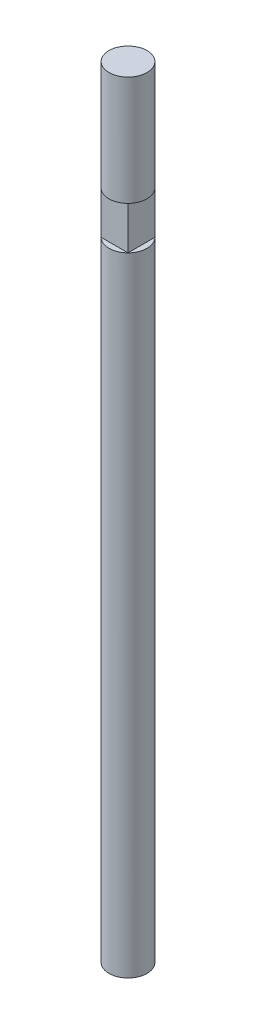
ISO-10303-21;
HEADER;
FILE_DESCRIPTION(('STEP AP214'),'2;1');
FILE_NAME('part.step','',(''),(''),'','','');
FILE_SCHEMA(('AUTOMOTIVE_DESIGN { 1 0 10303 214 1 1 1 1 }'));
ENDSEC;
DATA;
#1=APPLICATION_CONTEXT('core data for automotive mechanical design processes');
#2=APPLICATION_PROTOCOL_DEFINITION('international standard','automotive_design',2000,#1);
#3=PRODUCT_CONTEXT('',#1,'mechanical');
#4=PRODUCT('Part','Part','',(#3));
#5=PRODUCT_RELATED_PRODUCT_CATEGORY('part','',(#4));
#6=PRODUCT_DEFINITION_FORMATION('','',#4);
#7=PRODUCT_DEFINITION_CONTEXT('part definition',#1,'design');
#8=PRODUCT_DEFINITION('design','',#6,#7);
#9=PRODUCT_DEFINITION_SHAPE('','',#8);
#10=(LENGTH_UNIT() NAMED_UNIT(*) SI_UNIT(.MILLI.,.METRE.));
#11=(NAMED_UNIT(*) PLANE_ANGLE_UNIT() SI_UNIT($,.RADIAN.));
#12=(NAMED_UNIT(*) SI_UNIT($,.STERADIAN.) SOLID_ANGLE_UNIT());
#13=UNCERTAINTY_MEASURE_WITH_UNIT(LENGTH_MEASURE(1.E-05),#10,'distance_accuracy_value','');
#14=(GEOMETRIC_REPRESENTATION_CONTEXT(3) GLOBAL_UNCERTAINTY_ASSIGNED_CONTEXT((#13)) GLOBAL_UNIT_ASSIGNED_CONTEXT((#10,
#11,#12)) REPRESENTATION_CONTEXT('',''));
#15=CARTESIAN_POINT('',(0.,0.,0.));
#16=DIRECTION('',(0.,0.,1.));
#17=DIRECTION('',(1.,0.,0.));
#18=AXIS2_PLACEMENT_3D('',#15,#16,#17);
#19=CARTESIAN_POINT('',(0.,82.,0.));
#20=DIRECTION('',(0.,-1.,0.));
#21=DIRECTION('',(0.,0.,-1.));
#22=AXIS2_PLACEMENT_3D('',#19,#20,#21);
#23=CYLINDRICAL_SURFACE('',#22,2.);
#24=CARTESIAN_POINT('',(0.,82.,0.));
#25=DIRECTION('',(0.,1.,0.));
#26=DIRECTION('',(0.,0.,1.));
#27=AXIS2_PLACEMENT_3D('',#24,#25,#26);
#28=CIRCLE('',#27,2.);
#29=CARTESIAN_POINT('',(0.,82.,2.));
#30=VERTEX_POINT('',#29);
#31=EDGE_CURVE('E91',#30,#30,#28,.T.);
#32=ORIENTED_EDGE('',*,*,#31,.F.);
#33=EDGE_LOOP('',(#32));
#34=FACE_BOUND('',#33,.T.);
#35=CARTESIAN_POINT('',(0.,0.,0.));
#36=DIRECTION('',(0.,1.,0.));
#37=DIRECTION('',(0.,0.,1.));
#38=AXIS2_PLACEMENT_3D('',#35,#36,#37);
#39=CIRCLE('',#38,2.);
#40=CARTESIAN_POINT('',(0.,0.,2.));
#41=VERTEX_POINT('',#40);
#42=EDGE_CURVE('E94',#41,#41,#39,.T.);
#43=ORIENTED_EDGE('',*,*,#42,.T.);
#44=EDGE_LOOP('',(#43));
#45=FACE_BOUND('',#44,.T.);
#46=CARTESIAN_POINT('',(0.,66.,0.));
#47=DIRECTION('',(0.,1.,0.));
#48=DIRECTION('',(0.,0.,1.));
#49=AXIS2_PLACEMENT_3D('',#46,#47,#48);
#50=CIRCLE('',#49,2.);
#51=CARTESIAN_POINT('',(1.4142135623731,66.,1.41421356237309));
#52=VERTEX_POINT('',#51);
#53=CARTESIAN_POINT('',(1.41421356237309,66.,-1.41421356237309));
#54=VERTEX_POINT('',#53);
#55=EDGE_CURVE('E35',#52,#54,#50,.T.);
#56=ORIENTED_EDGE('',*,*,#55,.F.);
#57=CARTESIAN_POINT('',(-1.41421356237309,66.,1.41421356237309));
#58=VERTEX_POINT('',#57);
#59=EDGE_CURVE('E11',#58,#52,#50,.T.);
#60=ORIENTED_EDGE('',*,*,#59,.F.);
#61=DIRECTION('',(0.,1.,0.));
#62=VECTOR('',#61,1.);
#63=CARTESIAN_POINT('',(-1.41421356237309,66.,1.41421356237309));
#64=LINE('',#63,#62);
#65=CARTESIAN_POINT('',(-1.41421356237309,70.5,1.41421356237309));
#66=VERTEX_POINT('',#65);
#67=EDGE_CURVE('E48',#58,#66,#64,.T.);
#68=ORIENTED_EDGE('',*,*,#67,.T.);
#69=CARTESIAN_POINT('',(0.,70.5,0.));
#70=DIRECTION('',(0.,1.,0.));
#71=DIRECTION('',(0.,0.,1.));
#72=AXIS2_PLACEMENT_3D('',#69,#70,#71);
#73=CIRCLE('',#72,2.);
#74=CARTESIAN_POINT('',(1.4142135623731,70.5,1.41421356237309));
#75=VERTEX_POINT('',#74);
#76=EDGE_CURVE('E61',#66,#75,#73,.T.);
#77=ORIENTED_EDGE('',*,*,#76,.T.);
#78=CARTESIAN_POINT('',(1.41421356237309,70.5,-1.41421356237309));
#79=VERTEX_POINT('',#78);
#80=EDGE_CURVE('E73',#75,#79,#73,.T.);
#81=ORIENTED_EDGE('',*,*,#80,.T.);
#82=DIRECTION('',(0.,1.,0.));
#83=VECTOR('',#82,1.);
#84=CARTESIAN_POINT('',(1.41421356237309,66.,-1.41421356237309));
#85=LINE('',#84,#83);
#86=EDGE_CURVE('E79',#54,#79,#85,.T.);
#87=ORIENTED_EDGE('',*,*,#86,.F.);
#88=EDGE_LOOP('',(#56,#60,#68,#77,#81,#87));
#89=FACE_BOUND('',#88,.T.);
#90=ADVANCED_FACE('F32',(#34,#45,#89),#23,.T.);
#91=CARTESIAN_POINT('',(0.,82.,0.));
#92=DIRECTION('',(0.,1.,0.));
#93=DIRECTION('',(0.,0.,1.));
#94=AXIS2_PLACEMENT_3D('',#91,#92,#93);
#95=PLANE('',#94);
#96=ORIENTED_EDGE('',*,*,#31,.T.);
#97=EDGE_LOOP('',(#96));
#98=FACE_BOUND('',#97,.T.);
#99=ADVANCED_FACE('F115',(#98),#95,.T.);
#100=CARTESIAN_POINT('',(0.,0.,0.));
#101=DIRECTION('',(0.,1.,0.));
#102=DIRECTION('',(0.,0.,1.));
#103=AXIS2_PLACEMENT_3D('',#100,#101,#102);
#104=PLANE('',#103);
#105=ORIENTED_EDGE('',*,*,#42,.F.);
#106=EDGE_LOOP('',(#105));
#107=FACE_BOUND('',#106,.T.);
#108=ADVANCED_FACE('F120',(#107),#104,.F.);
#109=CARTESIAN_POINT('',(0.,66.,0.));
#110=DIRECTION('',(0.,1.,0.));
#111=DIRECTION('',(0.,0.,1.));
#112=AXIS2_PLACEMENT_3D('',#109,#110,#111);
#113=PLANE('',#112);
#114=ORIENTED_EDGE('',*,*,#55,.T.);
#115=DIRECTION('',(0.,0.,1.));
#116=VECTOR('',#115,1.);
#117=CARTESIAN_POINT('',(1.4142135623731,66.,1.41421356237309));
#118=LINE('',#117,#116);
#119=EDGE_CURVE('E70',#54,#52,#118,.T.);
#120=ORIENTED_EDGE('',*,*,#119,.T.);
#121=EDGE_LOOP('',(#114,#120));
#122=FACE_BOUND('',#121,.T.);
#123=ADVANCED_FACE('F69',(#122),#113,.T.);
#124=ORIENTED_EDGE('',*,*,#59,.T.);
#125=DIRECTION('',(-1.,0.,0.));
#126=VECTOR('',#125,1.);
#127=CARTESIAN_POINT('',(1.4142135623731,66.,1.41421356237309));
#128=LINE('',#127,#126);
#129=EDGE_CURVE('E83',#52,#58,#128,.T.);
#130=ORIENTED_EDGE('',*,*,#129,.T.);
#131=EDGE_LOOP('',(#124,#130));
#132=FACE_BOUND('',#131,.T.);
#133=ADVANCED_FACE('F112',(#132),#113,.T.);
#134=CARTESIAN_POINT('',(0.,70.5,0.));
#135=DIRECTION('',(0.,1.,0.));
#136=DIRECTION('',(0.,0.,1.));
#137=AXIS2_PLACEMENT_3D('',#134,#135,#136);
#138=PLANE('',#137);
#139=ORIENTED_EDGE('',*,*,#80,.F.);
#140=DIRECTION('',(0.,0.,1.));
#141=VECTOR('',#140,1.);
#142=CARTESIAN_POINT('',(1.4142135623731,70.5,1.41421356237309));
#143=LINE('',#142,#141);
#144=EDGE_CURVE('E100',#79,#75,#143,.T.);
#145=ORIENTED_EDGE('',*,*,#144,.F.);
#146=EDGE_LOOP('',(#139,#145));
#147=FACE_BOUND('',#146,.T.);
#148=ADVANCED_FACE('F102',(#147),#138,.F.);
#149=ORIENTED_EDGE('',*,*,#76,.F.);
#150=DIRECTION('',(-1.,0.,0.));
#151=VECTOR('',#150,1.);
#152=CARTESIAN_POINT('',(1.4142135623731,70.5,1.41421356237309));
#153=LINE('',#152,#151);
#154=EDGE_CURVE('E84',#75,#66,#153,.T.);
#155=ORIENTED_EDGE('',*,*,#154,.F.);
#156=EDGE_LOOP('',(#149,#155));
#157=FACE_BOUND('',#156,.T.);
#158=ADVANCED_FACE('F104',(#157),#138,.F.);
#159=CARTESIAN_POINT('',(1.4142135623731,66.,1.41421356237309));
#160=DIRECTION('',(0.,0.,-1.));
#161=DIRECTION('',(-1.,0.,0.));
#162=AXIS2_PLACEMENT_3D('',#159,#160,#161);
#163=PLANE('',#162);
#164=ORIENTED_EDGE('',*,*,#154,.T.);
#165=ORIENTED_EDGE('',*,*,#67,.F.);
#166=ORIENTED_EDGE('',*,*,#129,.F.);
#167=DIRECTION('',(0.,1.,0.));
#168=VECTOR('',#167,1.);
#169=CARTESIAN_POINT('',(1.4142135623731,66.,1.41421356237309));
#170=LINE('',#169,#168);
#171=EDGE_CURVE('E82',#52,#75,#170,.T.);
#172=ORIENTED_EDGE('',*,*,#171,.T.);
#173=EDGE_LOOP('',(#164,#165,#166,#172));
#174=FACE_BOUND('',#173,.T.);
#175=ADVANCED_FACE('F103',(#174),#163,.F.);
#176=CARTESIAN_POINT('',(1.4142135623731,66.,1.41421356237309));
#177=DIRECTION('',(-1.,0.,0.));
#178=DIRECTION('',(0.,0.,1.));
#179=AXIS2_PLACEMENT_3D('',#176,#177,#178);
#180=PLANE('',#179);
#181=ORIENTED_EDGE('',*,*,#144,.T.);
#182=ORIENTED_EDGE('',*,*,#171,.F.);
#183=ORIENTED_EDGE('',*,*,#119,.F.);
#184=ORIENTED_EDGE('',*,*,#86,.T.);
#185=EDGE_LOOP('',(#181,#182,#183,#184));
#186=FACE_BOUND('',#185,.T.);
#187=ADVANCED_FACE('F78',(#186),#180,.F.);
#188=CLOSED_SHELL('',(#90,#99,#108,#123,#133,#148,#158,#175,#187));
#189=MANIFOLD_SOLID_BREP('B2',#188);
#190=ADVANCED_BREP_SHAPE_REPRESENTATION('',(#18,#189),#14);
#191=SHAPE_DEFINITION_REPRESENTATION(#9,#190);
ENDSEC;
END-ISO-10303-21;
